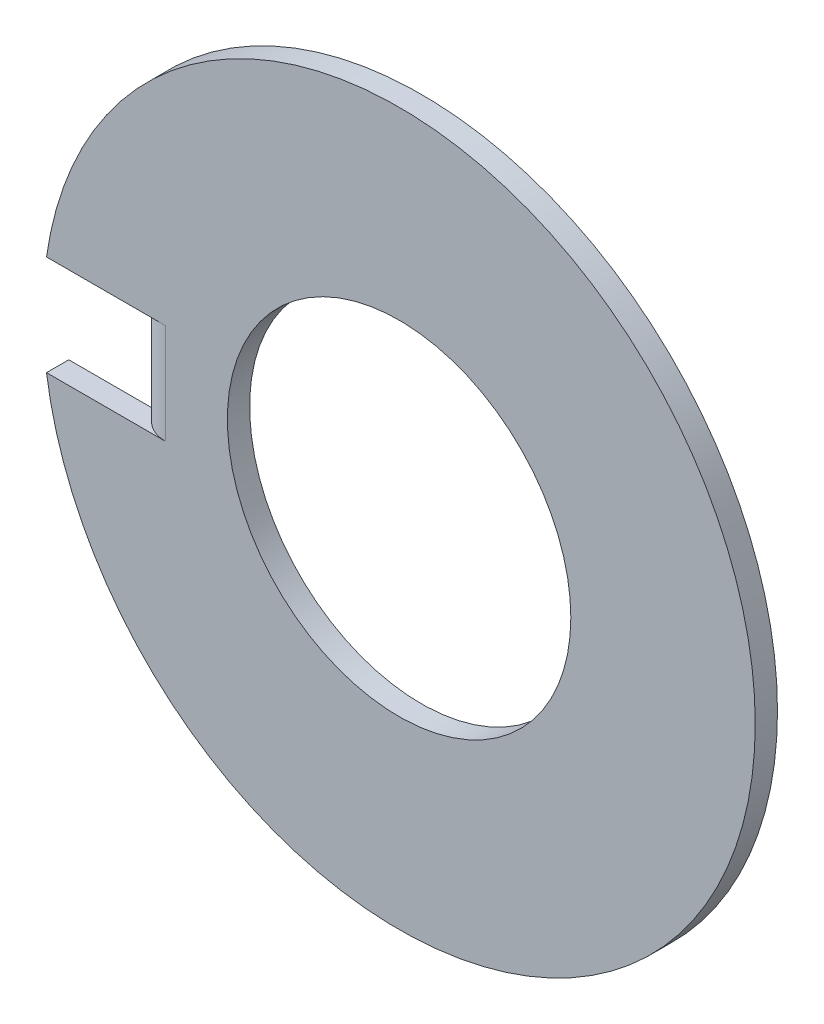
ISO-10303-21;
HEADER;
FILE_DESCRIPTION(('STEP AP214'),'2;1');
FILE_NAME('part.step','',(''),(''),'','','');
FILE_SCHEMA(('AUTOMOTIVE_DESIGN { 1 0 10303 214 1 1 1 1 }'));
ENDSEC;
DATA;
#1=APPLICATION_CONTEXT('core data for automotive mechanical design processes');
#2=APPLICATION_PROTOCOL_DEFINITION('international standard','automotive_design',2000,#1);
#3=PRODUCT_CONTEXT('',#1,'mechanical');
#4=PRODUCT('Part','Part','',(#3));
#5=PRODUCT_RELATED_PRODUCT_CATEGORY('part','',(#4));
#6=PRODUCT_DEFINITION_FORMATION('','',#4);
#7=PRODUCT_DEFINITION_CONTEXT('part definition',#1,'design');
#8=PRODUCT_DEFINITION('design','',#6,#7);
#9=PRODUCT_DEFINITION_SHAPE('','',#8);
#10=(LENGTH_UNIT() NAMED_UNIT(*) SI_UNIT(.MILLI.,.METRE.));
#11=(NAMED_UNIT(*) PLANE_ANGLE_UNIT() SI_UNIT($,.RADIAN.));
#12=(NAMED_UNIT(*) SI_UNIT($,.STERADIAN.) SOLID_ANGLE_UNIT());
#13=UNCERTAINTY_MEASURE_WITH_UNIT(LENGTH_MEASURE(1.E-05),#10,'distance_accuracy_value','');
#14=(GEOMETRIC_REPRESENTATION_CONTEXT(3) GLOBAL_UNCERTAINTY_ASSIGNED_CONTEXT((#13)) GLOBAL_UNIT_ASSIGNED_CONTEXT((#10,
#11,#12)) REPRESENTATION_CONTEXT('',''));
#15=CARTESIAN_POINT('',(0.,0.,0.));
#16=DIRECTION('',(0.,0.,1.));
#17=DIRECTION('',(1.,0.,0.));
#18=AXIS2_PLACEMENT_3D('',#15,#16,#17);
#19=CARTESIAN_POINT('',(0.,0.,1.));
#20=DIRECTION('',(0.,0.,1.));
#21=DIRECTION('',(1.,0.,0.));
#22=AXIS2_PLACEMENT_3D('',#19,#20,#21);
#23=PLANE('',#22);
#24=CARTESIAN_POINT('',(0.,0.,1.));
#25=DIRECTION('',(0.,0.,1.));
#26=DIRECTION('',(1.,0.,0.));
#27=AXIS2_PLACEMENT_3D('',#24,#25,#26);
#28=CIRCLE('',#27,7.715);
#29=CARTESIAN_POINT('',(7.715,0.,1.));
#30=VERTEX_POINT('',#29);
#31=EDGE_CURVE('E122',#30,#30,#28,.T.);
#32=ORIENTED_EDGE('',*,*,#31,.F.);
#33=EDGE_LOOP('',(#32));
#34=FACE_BOUND('',#33,.T.);
#35=DIRECTION('',(1.,0.,0.));
#36=VECTOR('',#35,1.);
#37=CARTESIAN_POINT('',(-15.8410069124409,2.25,1.));
#38=LINE('',#37,#36);
#39=CARTESIAN_POINT('',(-15.8410069124409,2.25,1.));
#40=VERTEX_POINT('',#39);
#41=CARTESIAN_POINT('',(-10.5,2.25,1.));
#42=VERTEX_POINT('',#41);
#43=EDGE_CURVE('E133',#40,#42,#38,.T.);
#44=ORIENTED_EDGE('',*,*,#43,.T.);
#45=DIRECTION('',(0.,1.,0.));
#46=VECTOR('',#45,1.);
#47=CARTESIAN_POINT('',(-10.5,2.25,1.));
#48=LINE('',#47,#46);
#49=CARTESIAN_POINT('',(-10.5,-2.25,1.));
#50=VERTEX_POINT('',#49);
#51=EDGE_CURVE('E149',#42,#50,#48,.F.);
#52=ORIENTED_EDGE('',*,*,#51,.T.);
#53=DIRECTION('',(-1.,0.,0.));
#54=VECTOR('',#53,1.);
#55=CARTESIAN_POINT('',(-12.,-2.25,1.));
#56=LINE('',#55,#54);
#57=CARTESIAN_POINT('',(-15.8410069124409,-2.25,1.));
#58=VERTEX_POINT('',#57);
#59=EDGE_CURVE('E90',#50,#58,#56,.T.);
#60=ORIENTED_EDGE('',*,*,#59,.T.);
#61=CARTESIAN_POINT('',(0.,0.,1.));
#62=DIRECTION('',(0.,0.,1.));
#63=DIRECTION('',(1.,0.,0.));
#64=AXIS2_PLACEMENT_3D('',#61,#62,#63);
#65=CIRCLE('',#64,16.);
#66=EDGE_CURVE('E117',#58,#40,#65,.T.);
#67=ORIENTED_EDGE('',*,*,#66,.T.);
#68=EDGE_LOOP('',(#44,#52,#60,#67));
#69=FACE_BOUND('',#68,.T.);
#70=ADVANCED_FACE('F61',(#34,#69),#23,.T.);
#71=CARTESIAN_POINT('',(0.,0.,0.));
#72=DIRECTION('',(0.,0.,1.));
#73=DIRECTION('',(1.,0.,0.));
#74=AXIS2_PLACEMENT_3D('',#71,#72,#73);
#75=PLANE('',#74);
#76=CARTESIAN_POINT('',(0.,0.,0.));
#77=DIRECTION('',(0.,0.,1.));
#78=DIRECTION('',(1.,0.,0.));
#79=AXIS2_PLACEMENT_3D('',#76,#77,#78);
#80=CIRCLE('',#79,7.715);
#81=CARTESIAN_POINT('',(7.715,0.,0.));
#82=VERTEX_POINT('',#81);
#83=EDGE_CURVE('E123',#82,#82,#80,.T.);
#84=ORIENTED_EDGE('',*,*,#83,.T.);
#85=EDGE_LOOP('',(#84));
#86=FACE_BOUND('',#85,.T.);
#87=DIRECTION('',(0.,1.,0.));
#88=VECTOR('',#87,1.);
#89=CARTESIAN_POINT('',(-10.5,2.25,0.));
#90=LINE('',#89,#88);
#91=CARTESIAN_POINT('',(-10.5,2.25,0.));
#92=VERTEX_POINT('',#91);
#93=CARTESIAN_POINT('',(-10.5,-2.25,0.));
#94=VERTEX_POINT('',#93);
#95=EDGE_CURVE('E145',#92,#94,#90,.F.);
#96=ORIENTED_EDGE('',*,*,#95,.F.);
#97=DIRECTION('',(1.,0.,0.));
#98=VECTOR('',#97,1.);
#99=CARTESIAN_POINT('',(-15.8410069124409,2.25,0.));
#100=LINE('',#99,#98);
#101=CARTESIAN_POINT('',(-11.9142135623731,2.25,0.));
#102=VERTEX_POINT('',#101);
#103=EDGE_CURVE('E76',#102,#92,#100,.T.);
#104=ORIENTED_EDGE('',*,*,#103,.F.);
#105=CARTESIAN_POINT('',(-15.8410069124409,2.25,0.));
#106=VERTEX_POINT('',#105);
#107=EDGE_CURVE('E115',#106,#102,#100,.T.);
#108=ORIENTED_EDGE('',*,*,#107,.F.);
#109=CARTESIAN_POINT('',(0.,0.,0.));
#110=DIRECTION('',(0.,0.,1.));
#111=DIRECTION('',(1.,0.,0.));
#112=AXIS2_PLACEMENT_3D('',#109,#110,#111);
#113=CIRCLE('',#112,16.);
#114=CARTESIAN_POINT('',(-15.8410069124409,-2.25,0.));
#115=VERTEX_POINT('',#114);
#116=EDGE_CURVE('E120',#115,#106,#113,.T.);
#117=ORIENTED_EDGE('',*,*,#116,.F.);
#118=DIRECTION('',(-1.,0.,0.));
#119=VECTOR('',#118,1.);
#120=CARTESIAN_POINT('',(-12.,-2.25,0.));
#121=LINE('',#120,#119);
#122=CARTESIAN_POINT('',(-11.9142135623731,-2.25,0.));
#123=VERTEX_POINT('',#122);
#124=EDGE_CURVE('E99',#123,#115,#121,.T.);
#125=ORIENTED_EDGE('',*,*,#124,.F.);
#126=EDGE_CURVE('E111',#94,#123,#121,.T.);
#127=ORIENTED_EDGE('',*,*,#126,.F.);
#128=EDGE_LOOP('',(#96,#104,#108,#117,#125,#127));
#129=FACE_BOUND('',#128,.T.);
#130=ADVANCED_FACE('F118',(#86,#129),#75,.F.);
#131=CARTESIAN_POINT('',(0.,0.,1.));
#132=DIRECTION('',(0.,0.,-1.));
#133=DIRECTION('',(-1.,0.,0.));
#134=AXIS2_PLACEMENT_3D('',#131,#132,#133);
#135=CYLINDRICAL_SURFACE('',#134,16.);
#136=ORIENTED_EDGE('',*,*,#116,.T.);
#137=DIRECTION('',(0.,0.,-1.));
#138=VECTOR('',#137,1.);
#139=CARTESIAN_POINT('',(-15.8410069124409,2.25,1.));
#140=LINE('',#139,#138);
#141=EDGE_CURVE('E64',#40,#106,#140,.T.);
#142=ORIENTED_EDGE('',*,*,#141,.F.);
#143=ORIENTED_EDGE('',*,*,#66,.F.);
#144=DIRECTION('',(0.,0.,-1.));
#145=VECTOR('',#144,1.);
#146=CARTESIAN_POINT('',(-15.8410069124409,-2.25,1.));
#147=LINE('',#146,#145);
#148=EDGE_CURVE('E101',#58,#115,#147,.T.);
#149=ORIENTED_EDGE('',*,*,#148,.T.);
#150=EDGE_LOOP('',(#136,#142,#143,#149));
#151=FACE_BOUND('',#150,.T.);
#152=ADVANCED_FACE('F62',(#151),#135,.T.);
#153=CARTESIAN_POINT('',(-15.8410069124409,2.25,1.));
#154=DIRECTION('',(0.,1.,0.));
#155=DIRECTION('',(0.,0.,1.));
#156=AXIS2_PLACEMENT_3D('',#153,#154,#155);
#157=PLANE('',#156);
#158=ORIENTED_EDGE('',*,*,#107,.T.);
#159=CARTESIAN_POINT('',(-10.5,2.25,-0.5));
#160=DIRECTION('',(0.,1.,0.));
#161=DIRECTION('',(0.,0.,1.));
#162=AXIS2_PLACEMENT_3D('',#159,#160,#161);
#163=CIRCLE('',#162,1.5);
#164=EDGE_CURVE('E13',#102,#42,#163,.T.);
#165=ORIENTED_EDGE('',*,*,#164,.T.);
#166=ORIENTED_EDGE('',*,*,#43,.F.);
#167=ORIENTED_EDGE('',*,*,#141,.T.);
#168=EDGE_LOOP('',(#158,#165,#166,#167));
#169=FACE_BOUND('',#168,.T.);
#170=ADVANCED_FACE('F230',(#169),#157,.F.);
#171=CARTESIAN_POINT('',(-12.,-2.25,1.));
#172=DIRECTION('',(0.,-1.,0.));
#173=DIRECTION('',(1.,0.,0.));
#174=AXIS2_PLACEMENT_3D('',#171,#172,#173);
#175=PLANE('',#174);
#176=ORIENTED_EDGE('',*,*,#59,.F.);
#177=CARTESIAN_POINT('',(-10.5,-2.25,-0.5));
#178=DIRECTION('',(0.,1.,0.));
#179=DIRECTION('',(0.,0.,1.));
#180=AXIS2_PLACEMENT_3D('',#177,#178,#179);
#181=CIRCLE('',#180,1.5);
#182=EDGE_CURVE('E110',#50,#123,#181,.F.);
#183=ORIENTED_EDGE('',*,*,#182,.T.);
#184=ORIENTED_EDGE('',*,*,#124,.T.);
#185=ORIENTED_EDGE('',*,*,#148,.F.);
#186=EDGE_LOOP('',(#176,#183,#184,#185));
#187=FACE_BOUND('',#186,.T.);
#188=ADVANCED_FACE('F105',(#187),#175,.F.);
#189=CARTESIAN_POINT('',(0.,0.,1.));
#190=DIRECTION('',(0.,0.,-1.));
#191=DIRECTION('',(-1.,0.,0.));
#192=AXIS2_PLACEMENT_3D('',#189,#190,#191);
#193=CYLINDRICAL_SURFACE('',#192,7.715);
#194=ORIENTED_EDGE('',*,*,#31,.T.);
#195=EDGE_LOOP('',(#194));
#196=FACE_BOUND('',#195,.T.);
#197=ORIENTED_EDGE('',*,*,#83,.F.);
#198=EDGE_LOOP('',(#197));
#199=FACE_BOUND('',#198,.T.);
#200=ADVANCED_FACE('F238',(#196,#199),#193,.F.);
#201=CARTESIAN_POINT('',(-10.5,-2.25,-0.5));
#202=DIRECTION('',(0.,-1.,0.));
#203=DIRECTION('',(0.,0.,-1.));
#204=AXIS2_PLACEMENT_3D('',#201,#202,#203);
#205=PLANE('',#204);
#206=CARTESIAN_POINT('',(-10.5,-2.25,-0.5));
#207=DIRECTION('',(0.,1.,0.));
#208=DIRECTION('',(0.,0.,1.));
#209=AXIS2_PLACEMENT_3D('',#206,#207,#208);
#210=CIRCLE('',#209,0.5);
#211=CARTESIAN_POINT('',(-11.,-2.25,-0.499999999999999));
#212=VERTEX_POINT('',#211);
#213=EDGE_CURVE('E146',#94,#212,#210,.F.);
#214=ORIENTED_EDGE('',*,*,#213,.F.);
#215=ORIENTED_EDGE('',*,*,#126,.T.);
#216=CARTESIAN_POINT('',(-12.,-2.25,-0.499999999999995));
#217=VERTEX_POINT('',#216);
#218=EDGE_CURVE('E155',#123,#217,#181,.F.);
#219=ORIENTED_EDGE('',*,*,#218,.T.);
#220=DIRECTION('',(1.,0.,0.));
#221=VECTOR('',#220,1.);
#222=CARTESIAN_POINT('',(-12.,-2.25,-0.499999999999995));
#223=LINE('',#222,#221);
#224=EDGE_CURVE('E152',#212,#217,#223,.F.);
#225=ORIENTED_EDGE('',*,*,#224,.F.);
#226=EDGE_LOOP('',(#214,#215,#219,#225));
#227=FACE_BOUND('',#226,.T.);
#228=ADVANCED_FACE('F232',(#227),#205,.T.);
#229=CARTESIAN_POINT('',(-10.5,2.25,-0.5));
#230=DIRECTION('',(0.,-1.,0.));
#231=DIRECTION('',(0.,0.,-1.));
#232=AXIS2_PLACEMENT_3D('',#229,#230,#231);
#233=PLANE('',#232);
#234=CARTESIAN_POINT('',(-12.,2.25,-0.499999999999995));
#235=VERTEX_POINT('',#234);
#236=EDGE_CURVE('E74',#235,#102,#163,.T.);
#237=ORIENTED_EDGE('',*,*,#236,.T.);
#238=ORIENTED_EDGE('',*,*,#103,.T.);
#239=CARTESIAN_POINT('',(-10.5,2.25,-0.5));
#240=DIRECTION('',(0.,1.,0.));
#241=DIRECTION('',(0.,0.,1.));
#242=AXIS2_PLACEMENT_3D('',#239,#240,#241);
#243=CIRCLE('',#242,0.5);
#244=CARTESIAN_POINT('',(-11.,2.25,-0.499999999999999));
#245=VERTEX_POINT('',#244);
#246=EDGE_CURVE('E138',#245,#92,#243,.T.);
#247=ORIENTED_EDGE('',*,*,#246,.F.);
#248=DIRECTION('',(1.,0.,0.));
#249=VECTOR('',#248,1.);
#250=CARTESIAN_POINT('',(-11.,2.25,-0.499999999999999));
#251=LINE('',#250,#249);
#252=EDGE_CURVE('E157',#245,#235,#251,.F.);
#253=ORIENTED_EDGE('',*,*,#252,.T.);
#254=EDGE_LOOP('',(#237,#238,#247,#253));
#255=FACE_BOUND('',#254,.T.);
#256=ADVANCED_FACE('F240',(#255),#233,.F.);
#257=CARTESIAN_POINT('',(-10.5,2.25,-0.5));
#258=DIRECTION('',(0.,1.,0.));
#259=DIRECTION('',(-1.,0.,0.));
#260=AXIS2_PLACEMENT_3D('',#257,#258,#259);
#261=CYLINDRICAL_SURFACE('',#260,1.5);
#262=ORIENTED_EDGE('',*,*,#51,.F.);
#263=ORIENTED_EDGE('',*,*,#164,.F.);
#264=ORIENTED_EDGE('',*,*,#236,.F.);
#265=DIRECTION('',(0.,1.,0.));
#266=VECTOR('',#265,1.);
#267=CARTESIAN_POINT('',(-12.,-2.25,-0.499999999999995));
#268=LINE('',#267,#266);
#269=EDGE_CURVE('E161',#235,#217,#268,.F.);
#270=ORIENTED_EDGE('',*,*,#269,.T.);
#271=ORIENTED_EDGE('',*,*,#218,.F.);
#272=ORIENTED_EDGE('',*,*,#182,.F.);
#273=EDGE_LOOP('',(#262,#263,#264,#270,#271,#272));
#274=FACE_BOUND('',#273,.T.);
#275=ADVANCED_FACE('F231',(#274),#261,.T.);
#276=CARTESIAN_POINT('',(-10.5,2.25,-0.5));
#277=DIRECTION('',(0.,1.,0.));
#278=DIRECTION('',(-1.,0.,0.));
#279=AXIS2_PLACEMENT_3D('',#276,#277,#278);
#280=CYLINDRICAL_SURFACE('',#279,0.5);
#281=ORIENTED_EDGE('',*,*,#95,.T.);
#282=ORIENTED_EDGE('',*,*,#213,.T.);
#283=DIRECTION('',(0.,1.,0.));
#284=VECTOR('',#283,1.);
#285=CARTESIAN_POINT('',(-11.,-2.25,-0.499999999999999));
#286=LINE('',#285,#284);
#287=EDGE_CURVE('E156',#212,#245,#286,.T.);
#288=ORIENTED_EDGE('',*,*,#287,.T.);
#289=ORIENTED_EDGE('',*,*,#246,.T.);
#290=EDGE_LOOP('',(#281,#282,#288,#289));
#291=FACE_BOUND('',#290,.T.);
#292=ADVANCED_FACE('F316',(#291),#280,.F.);
#293=CARTESIAN_POINT('',(-12.,2.25,-3.));
#294=DIRECTION('',(0.,-1.,0.));
#295=DIRECTION('',(0.,0.,-1.));
#296=AXIS2_PLACEMENT_3D('',#293,#294,#295);
#297=PLANE('',#296);
#298=ORIENTED_EDGE('',*,*,#252,.F.);
#299=DIRECTION('',(0.,0.,1.));
#300=VECTOR('',#299,1.);
#301=CARTESIAN_POINT('',(-11.,2.25,-3.));
#302=LINE('',#301,#300);
#303=CARTESIAN_POINT('',(-11.,2.25,-3.));
#304=VERTEX_POINT('',#303);
#305=EDGE_CURVE('E168',#245,#304,#302,.F.);
#306=ORIENTED_EDGE('',*,*,#305,.T.);
#307=DIRECTION('',(1.,0.,0.));
#308=VECTOR('',#307,1.);
#309=CARTESIAN_POINT('',(-12.,2.25,-3.));
#310=LINE('',#309,#308);
#311=CARTESIAN_POINT('',(-12.,2.25,-3.));
#312=VERTEX_POINT('',#311);
#313=EDGE_CURVE('E141',#312,#304,#310,.T.);
#314=ORIENTED_EDGE('',*,*,#313,.F.);
#315=DIRECTION('',(0.,0.,-1.));
#316=VECTOR('',#315,1.);
#317=CARTESIAN_POINT('',(-12.,2.25,0.));
#318=LINE('',#317,#316);
#319=EDGE_CURVE('E174',#235,#312,#318,.T.);
#320=ORIENTED_EDGE('',*,*,#319,.F.);
#321=EDGE_LOOP('',(#298,#306,#314,#320));
#322=FACE_BOUND('',#321,.T.);
#323=ADVANCED_FACE('F327',(#322),#297,.F.);
#324=CARTESIAN_POINT('',(-12.,-2.25,0.));
#325=DIRECTION('',(0.,1.,0.));
#326=DIRECTION('',(0.,0.,1.));
#327=AXIS2_PLACEMENT_3D('',#324,#325,#326);
#328=PLANE('',#327);
#329=ORIENTED_EDGE('',*,*,#224,.T.);
#330=DIRECTION('',(0.,0.,1.));
#331=VECTOR('',#330,1.);
#332=CARTESIAN_POINT('',(-12.,-2.25,0.));
#333=LINE('',#332,#331);
#334=CARTESIAN_POINT('',(-12.,-2.25,-3.));
#335=VERTEX_POINT('',#334);
#336=EDGE_CURVE('E181',#335,#217,#333,.T.);
#337=ORIENTED_EDGE('',*,*,#336,.F.);
#338=DIRECTION('',(1.,0.,0.));
#339=VECTOR('',#338,1.);
#340=CARTESIAN_POINT('',(-12.,-2.25,-3.));
#341=LINE('',#340,#339);
#342=CARTESIAN_POINT('',(-11.,-2.25,-3.));
#343=VERTEX_POINT('',#342);
#344=EDGE_CURVE('E183',#335,#343,#341,.T.);
#345=ORIENTED_EDGE('',*,*,#344,.T.);
#346=DIRECTION('',(0.,0.,-1.));
#347=VECTOR('',#346,1.);
#348=CARTESIAN_POINT('',(-11.,-2.25,0.));
#349=LINE('',#348,#347);
#350=EDGE_CURVE('E175',#343,#212,#349,.F.);
#351=ORIENTED_EDGE('',*,*,#350,.T.);
#352=EDGE_LOOP('',(#329,#337,#345,#351));
#353=FACE_BOUND('',#352,.T.);
#354=ADVANCED_FACE('F208',(#353),#328,.F.);
#355=CARTESIAN_POINT('',(-12.,-2.25,0.));
#356=DIRECTION('',(1.,0.,0.));
#357=DIRECTION('',(0.,0.,-1.));
#358=AXIS2_PLACEMENT_3D('',#355,#356,#357);
#359=PLANE('',#358);
#360=ORIENTED_EDGE('',*,*,#269,.F.);
#361=ORIENTED_EDGE('',*,*,#319,.T.);
#362=DIRECTION('',(0.,-1.,0.));
#363=VECTOR('',#362,1.);
#364=CARTESIAN_POINT('',(-12.,-2.25,-3.));
#365=LINE('',#364,#363);
#366=EDGE_CURVE('E178',#312,#335,#365,.T.);
#367=ORIENTED_EDGE('',*,*,#366,.T.);
#368=ORIENTED_EDGE('',*,*,#336,.T.);
#369=EDGE_LOOP('',(#360,#361,#367,#368));
#370=FACE_BOUND('',#369,.T.);
#371=ADVANCED_FACE('F348',(#370),#359,.F.);
#372=CARTESIAN_POINT('',(-11.,-2.25,0.));
#373=DIRECTION('',(1.,0.,0.));
#374=DIRECTION('',(0.,0.,-1.));
#375=AXIS2_PLACEMENT_3D('',#372,#373,#374);
#376=PLANE('',#375);
#377=ORIENTED_EDGE('',*,*,#305,.F.);
#378=ORIENTED_EDGE('',*,*,#287,.F.);
#379=ORIENTED_EDGE('',*,*,#350,.F.);
#380=DIRECTION('',(0.,1.,0.));
#381=VECTOR('',#380,1.);
#382=CARTESIAN_POINT('',(-11.,-2.25,-3.));
#383=LINE('',#382,#381);
#384=EDGE_CURVE('E169',#304,#343,#383,.F.);
#385=ORIENTED_EDGE('',*,*,#384,.F.);
#386=EDGE_LOOP('',(#377,#378,#379,#385));
#387=FACE_BOUND('',#386,.T.);
#388=ADVANCED_FACE('F203',(#387),#376,.T.);
#389=CARTESIAN_POINT('',(-12.,-2.25,-3.));
#390=DIRECTION('',(0.,0.,1.));
#391=DIRECTION('',(1.,0.,0.));
#392=AXIS2_PLACEMENT_3D('',#389,#390,#391);
#393=PLANE('',#392);
#394=ORIENTED_EDGE('',*,*,#384,.T.);
#395=ORIENTED_EDGE('',*,*,#344,.F.);
#396=ORIENTED_EDGE('',*,*,#366,.F.);
#397=ORIENTED_EDGE('',*,*,#313,.T.);
#398=EDGE_LOOP('',(#394,#395,#396,#397));
#399=FACE_BOUND('',#398,.T.);
#400=ADVANCED_FACE('F192',(#399),#393,.F.);
#401=CLOSED_SHELL('',(#70,#130,#152,#170,#188,#200,#228,#256,#275,#292,#323,#354,#371,#388,#400));
#402=MANIFOLD_SOLID_BREP('B2',#401);
#403=ADVANCED_BREP_SHAPE_REPRESENTATION('',(#18,#402),#14);
#404=SHAPE_DEFINITION_REPRESENTATION(#9,#403);
ENDSEC;
END-ISO-10303-21;
